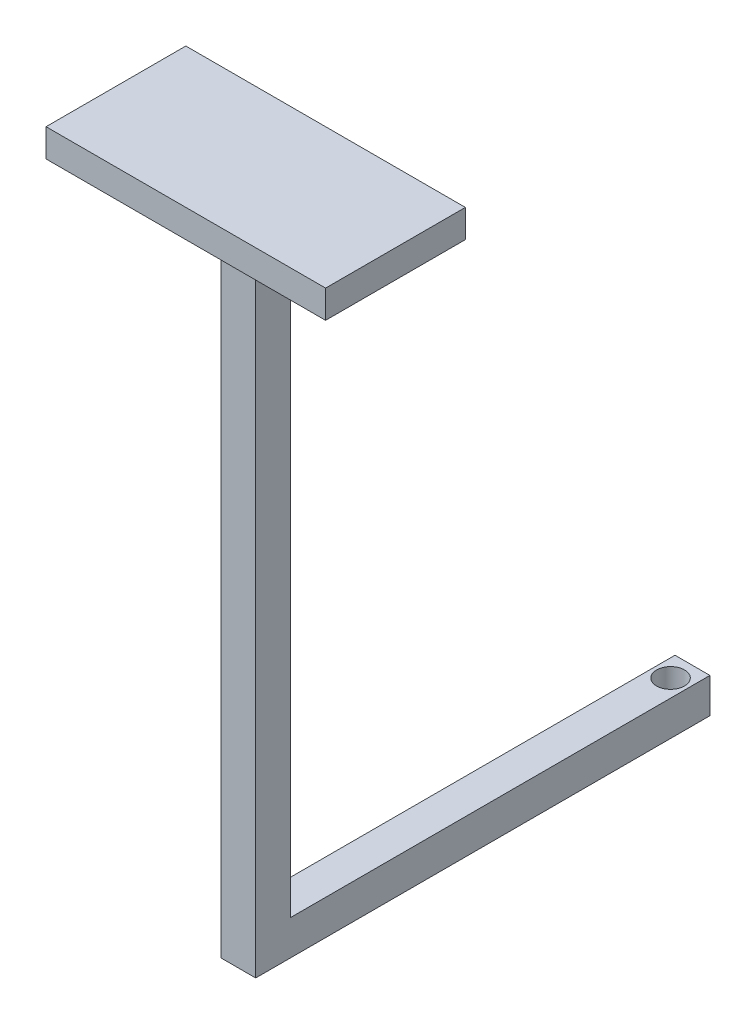
ISO-10303-21;
HEADER;
FILE_DESCRIPTION(('STEP AP214'),'2;1');
FILE_NAME('part.step','',(''),(''),'','','');
FILE_SCHEMA(('AUTOMOTIVE_DESIGN { 1 0 10303 214 1 1 1 1 }'));
ENDSEC;
DATA;
#1=APPLICATION_CONTEXT('core data for automotive mechanical design processes');
#2=APPLICATION_PROTOCOL_DEFINITION('international standard','automotive_design',2000,#1);
#3=PRODUCT_CONTEXT('',#1,'mechanical');
#4=PRODUCT('Part','Part','',(#3));
#5=PRODUCT_RELATED_PRODUCT_CATEGORY('part','',(#4));
#6=PRODUCT_DEFINITION_FORMATION('','',#4);
#7=PRODUCT_DEFINITION_CONTEXT('part definition',#1,'design');
#8=PRODUCT_DEFINITION('design','',#6,#7);
#9=PRODUCT_DEFINITION_SHAPE('','',#8);
#10=(LENGTH_UNIT() NAMED_UNIT(*) SI_UNIT(.MILLI.,.METRE.));
#11=(NAMED_UNIT(*) PLANE_ANGLE_UNIT() SI_UNIT($,.RADIAN.));
#12=(NAMED_UNIT(*) SI_UNIT($,.STERADIAN.) SOLID_ANGLE_UNIT());
#13=UNCERTAINTY_MEASURE_WITH_UNIT(LENGTH_MEASURE(1.E-05),#10,'distance_accuracy_value','');
#14=(GEOMETRIC_REPRESENTATION_CONTEXT(3) GLOBAL_UNCERTAINTY_ASSIGNED_CONTEXT((#13)) GLOBAL_UNIT_ASSIGNED_CONTEXT((#10,
#11,#12)) REPRESENTATION_CONTEXT('',''));
#15=CARTESIAN_POINT('',(0.,0.,0.));
#16=DIRECTION('',(0.,0.,1.));
#17=DIRECTION('',(1.,0.,0.));
#18=AXIS2_PLACEMENT_3D('',#15,#16,#17);
#19=CARTESIAN_POINT('',(-12.5,-470.,-12.5));
#20=DIRECTION('',(0.,0.,-1.));
#21=DIRECTION('',(-1.,0.,0.));
#22=AXIS2_PLACEMENT_3D('',#19,#20,#21);
#23=PLANE('',#22);
#24=DIRECTION('',(0.,1.,0.));
#25=VECTOR('',#24,1.);
#26=CARTESIAN_POINT('',(12.5,-470.,-12.5));
#27=LINE('',#26,#25);
#28=CARTESIAN_POINT('',(12.5,-445.,-12.5));
#29=VERTEX_POINT('',#28);
#30=CARTESIAN_POINT('',(12.5,0.,-12.5));
#31=VERTEX_POINT('',#30);
#32=EDGE_CURVE('E53',#29,#31,#27,.T.);
#33=ORIENTED_EDGE('',*,*,#32,.F.);
#34=DIRECTION('',(1.,0.,0.));
#35=VECTOR('',#34,1.);
#36=CARTESIAN_POINT('',(12.5,-445.,-12.5));
#37=LINE('',#36,#35);
#38=CARTESIAN_POINT('',(-12.5,-445.,-12.5));
#39=VERTEX_POINT('',#38);
#40=EDGE_CURVE('E48',#39,#29,#37,.T.);
#41=ORIENTED_EDGE('',*,*,#40,.F.);
#42=DIRECTION('',(0.,1.,0.));
#43=VECTOR('',#42,1.);
#44=CARTESIAN_POINT('',(-12.5,-470.,-12.5));
#45=LINE('',#44,#43);
#46=CARTESIAN_POINT('',(-12.5,0.,-12.5));
#47=VERTEX_POINT('',#46);
#48=EDGE_CURVE('E165',#39,#47,#45,.T.);
#49=ORIENTED_EDGE('',*,*,#48,.T.);
#50=DIRECTION('',(-1.,0.,0.));
#51=VECTOR('',#50,1.);
#52=CARTESIAN_POINT('',(-12.5,0.,-12.5));
#53=LINE('',#52,#51);
#54=EDGE_CURVE('E154',#31,#47,#53,.T.);
#55=ORIENTED_EDGE('',*,*,#54,.F.);
#56=EDGE_LOOP('',(#33,#41,#49,#55));
#57=FACE_BOUND('',#56,.T.);
#58=ADVANCED_FACE('F33',(#57),#23,.T.);
#59=CARTESIAN_POINT('',(100.,20.,50.));
#60=DIRECTION('',(-1.,0.,0.));
#61=DIRECTION('',(0.,0.,1.));
#62=AXIS2_PLACEMENT_3D('',#59,#60,#61);
#63=PLANE('',#62);
#64=DIRECTION('',(0.,0.,-1.));
#65=VECTOR('',#64,1.);
#66=CARTESIAN_POINT('',(100.,0.,50.));
#67=LINE('',#66,#65);
#68=CARTESIAN_POINT('',(100.,0.,50.));
#69=VERTEX_POINT('',#68);
#70=CARTESIAN_POINT('',(100.,0.,-50.));
#71=VERTEX_POINT('',#70);
#72=EDGE_CURVE('E161',#69,#71,#67,.T.);
#73=ORIENTED_EDGE('',*,*,#72,.T.);
#74=DIRECTION('',(0.,-1.,0.));
#75=VECTOR('',#74,1.);
#76=CARTESIAN_POINT('',(100.,20.,-50.));
#77=LINE('',#76,#75);
#78=CARTESIAN_POINT('',(100.,20.,-50.));
#79=VERTEX_POINT('',#78);
#80=EDGE_CURVE('E11',#79,#71,#77,.T.);
#81=ORIENTED_EDGE('',*,*,#80,.F.);
#82=DIRECTION('',(0.,0.,-1.));
#83=VECTOR('',#82,1.);
#84=CARTESIAN_POINT('',(100.,20.,50.));
#85=LINE('',#84,#83);
#86=CARTESIAN_POINT('',(100.,20.,50.));
#87=VERTEX_POINT('',#86);
#88=EDGE_CURVE('E168',#87,#79,#85,.T.);
#89=ORIENTED_EDGE('',*,*,#88,.F.);
#90=DIRECTION('',(0.,-1.,0.));
#91=VECTOR('',#90,1.);
#92=CARTESIAN_POINT('',(100.,20.,50.));
#93=LINE('',#92,#91);
#94=EDGE_CURVE('E178',#87,#69,#93,.T.);
#95=ORIENTED_EDGE('',*,*,#94,.T.);
#96=EDGE_LOOP('',(#73,#81,#89,#95));
#97=FACE_BOUND('',#96,.T.);
#98=ADVANCED_FACE('F35',(#97),#63,.F.);
#99=CARTESIAN_POINT('',(-100.,20.,-50.));
#100=DIRECTION('',(0.,0.,1.));
#101=DIRECTION('',(1.,0.,0.));
#102=AXIS2_PLACEMENT_3D('',#99,#100,#101);
#103=PLANE('',#102);
#104=DIRECTION('',(-1.,0.,0.));
#105=VECTOR('',#104,1.);
#106=CARTESIAN_POINT('',(-100.,0.,-50.));
#107=LINE('',#106,#105);
#108=CARTESIAN_POINT('',(-100.,0.,-50.));
#109=VERTEX_POINT('',#108);
#110=EDGE_CURVE('E181',#71,#109,#107,.T.);
#111=ORIENTED_EDGE('',*,*,#110,.T.);
#112=DIRECTION('',(0.,-1.,0.));
#113=VECTOR('',#112,1.);
#114=CARTESIAN_POINT('',(-100.,20.,-50.));
#115=LINE('',#114,#113);
#116=CARTESIAN_POINT('',(-100.,20.,-50.));
#117=VERTEX_POINT('',#116);
#118=EDGE_CURVE('E41',#117,#109,#115,.T.);
#119=ORIENTED_EDGE('',*,*,#118,.F.);
#120=DIRECTION('',(-1.,0.,0.));
#121=VECTOR('',#120,1.);
#122=CARTESIAN_POINT('',(-100.,20.,-50.));
#123=LINE('',#122,#121);
#124=EDGE_CURVE('E171',#79,#117,#123,.T.);
#125=ORIENTED_EDGE('',*,*,#124,.F.);
#126=ORIENTED_EDGE('',*,*,#80,.T.);
#127=EDGE_LOOP('',(#111,#119,#125,#126));
#128=FACE_BOUND('',#127,.T.);
#129=ADVANCED_FACE('F211',(#128),#103,.F.);
#130=CARTESIAN_POINT('',(-100.,20.,50.));
#131=DIRECTION('',(1.,0.,0.));
#132=DIRECTION('',(0.,0.,-1.));
#133=AXIS2_PLACEMENT_3D('',#130,#131,#132);
#134=PLANE('',#133);
#135=DIRECTION('',(0.,0.,1.));
#136=VECTOR('',#135,1.);
#137=CARTESIAN_POINT('',(-100.,0.,50.));
#138=LINE('',#137,#136);
#139=CARTESIAN_POINT('',(-100.,0.,50.));
#140=VERTEX_POINT('',#139);
#141=EDGE_CURVE('E183',#109,#140,#138,.T.);
#142=ORIENTED_EDGE('',*,*,#141,.T.);
#143=DIRECTION('',(0.,-1.,0.));
#144=VECTOR('',#143,1.);
#145=CARTESIAN_POINT('',(-100.,20.,50.));
#146=LINE('',#145,#144);
#147=CARTESIAN_POINT('',(-100.,20.,50.));
#148=VERTEX_POINT('',#147);
#149=EDGE_CURVE('E188',#148,#140,#146,.T.);
#150=ORIENTED_EDGE('',*,*,#149,.F.);
#151=DIRECTION('',(0.,0.,1.));
#152=VECTOR('',#151,1.);
#153=CARTESIAN_POINT('',(-100.,20.,50.));
#154=LINE('',#153,#152);
#155=EDGE_CURVE('E174',#117,#148,#154,.T.);
#156=ORIENTED_EDGE('',*,*,#155,.F.);
#157=ORIENTED_EDGE('',*,*,#118,.T.);
#158=EDGE_LOOP('',(#142,#150,#156,#157));
#159=FACE_BOUND('',#158,.T.);
#160=ADVANCED_FACE('F195',(#159),#134,.F.);
#161=CARTESIAN_POINT('',(-100.,20.,50.));
#162=DIRECTION('',(0.,0.,-1.));
#163=DIRECTION('',(-1.,0.,0.));
#164=AXIS2_PLACEMENT_3D('',#161,#162,#163);
#165=PLANE('',#164);
#166=DIRECTION('',(1.,0.,0.));
#167=VECTOR('',#166,1.);
#168=CARTESIAN_POINT('',(-100.,0.,50.));
#169=LINE('',#168,#167);
#170=EDGE_CURVE('E172',#140,#69,#169,.T.);
#171=ORIENTED_EDGE('',*,*,#170,.T.);
#172=ORIENTED_EDGE('',*,*,#94,.F.);
#173=DIRECTION('',(1.,0.,0.));
#174=VECTOR('',#173,1.);
#175=CARTESIAN_POINT('',(-100.,20.,50.));
#176=LINE('',#175,#174);
#177=EDGE_CURVE('E176',#148,#87,#176,.T.);
#178=ORIENTED_EDGE('',*,*,#177,.F.);
#179=ORIENTED_EDGE('',*,*,#149,.T.);
#180=EDGE_LOOP('',(#171,#172,#178,#179));
#181=FACE_BOUND('',#180,.T.);
#182=ADVANCED_FACE('F204',(#181),#165,.F.);
#183=CARTESIAN_POINT('',(0.,20.,0.));
#184=DIRECTION('',(0.,-1.,0.));
#185=DIRECTION('',(0.,0.,-1.));
#186=AXIS2_PLACEMENT_3D('',#183,#184,#185);
#187=PLANE('',#186);
#188=ORIENTED_EDGE('',*,*,#88,.T.);
#189=ORIENTED_EDGE('',*,*,#124,.T.);
#190=ORIENTED_EDGE('',*,*,#155,.T.);
#191=ORIENTED_EDGE('',*,*,#177,.T.);
#192=EDGE_LOOP('',(#188,#189,#190,#191));
#193=FACE_BOUND('',#192,.T.);
#194=ADVANCED_FACE('F210',(#193),#187,.F.);
#195=CARTESIAN_POINT('',(0.,0.,0.));
#196=DIRECTION('',(0.,-1.,0.));
#197=DIRECTION('',(0.,0.,-1.));
#198=AXIS2_PLACEMENT_3D('',#195,#196,#197);
#199=PLANE('',#198);
#200=DIRECTION('',(0.,0.,-1.));
#201=VECTOR('',#200,1.);
#202=CARTESIAN_POINT('',(12.5,0.,12.5));
#203=LINE('',#202,#201);
#204=CARTESIAN_POINT('',(12.5,0.,12.5));
#205=VERTEX_POINT('',#204);
#206=EDGE_CURVE('E147',#205,#31,#203,.T.);
#207=ORIENTED_EDGE('',*,*,#206,.T.);
#208=ORIENTED_EDGE('',*,*,#54,.T.);
#209=DIRECTION('',(0.,0.,1.));
#210=VECTOR('',#209,1.);
#211=CARTESIAN_POINT('',(-12.5,0.,12.5));
#212=LINE('',#211,#210);
#213=CARTESIAN_POINT('',(-12.5,0.,12.5));
#214=VERTEX_POINT('',#213);
#215=EDGE_CURVE('E157',#47,#214,#212,.T.);
#216=ORIENTED_EDGE('',*,*,#215,.T.);
#217=DIRECTION('',(1.,0.,0.));
#218=VECTOR('',#217,1.);
#219=CARTESIAN_POINT('',(-12.5,0.,12.5));
#220=LINE('',#219,#218);
#221=EDGE_CURVE('E121',#214,#205,#220,.T.);
#222=ORIENTED_EDGE('',*,*,#221,.T.);
#223=EDGE_LOOP('',(#207,#208,#216,#222));
#224=FACE_BOUND('',#223,.T.);
#225=ORIENTED_EDGE('',*,*,#72,.F.);
#226=ORIENTED_EDGE('',*,*,#170,.F.);
#227=ORIENTED_EDGE('',*,*,#141,.F.);
#228=ORIENTED_EDGE('',*,*,#110,.F.);
#229=EDGE_LOOP('',(#225,#226,#227,#228));
#230=FACE_BOUND('',#229,.T.);
#231=ADVANCED_FACE('F201',(#224,#230),#199,.T.);
#232=CARTESIAN_POINT('',(12.5,-470.,12.5));
#233=DIRECTION('',(1.,0.,0.));
#234=DIRECTION('',(0.,0.,-1.));
#235=AXIS2_PLACEMENT_3D('',#232,#233,#234);
#236=PLANE('',#235);
#237=ORIENTED_EDGE('',*,*,#206,.F.);
#238=DIRECTION('',(0.,1.,0.));
#239=VECTOR('',#238,1.);
#240=CARTESIAN_POINT('',(12.5,-470.,12.5));
#241=LINE('',#240,#239);
#242=CARTESIAN_POINT('',(12.5,-470.,12.5));
#243=VERTEX_POINT('',#242);
#244=EDGE_CURVE('E116',#243,#205,#241,.T.);
#245=ORIENTED_EDGE('',*,*,#244,.F.);
#246=DIRECTION('',(0.,0.,-1.));
#247=VECTOR('',#246,1.);
#248=CARTESIAN_POINT('',(12.5,-470.,12.5));
#249=LINE('',#248,#247);
#250=CARTESIAN_POINT('',(12.5,-470.,-312.5));
#251=VERTEX_POINT('',#250);
#252=EDGE_CURVE('E108',#243,#251,#249,.T.);
#253=ORIENTED_EDGE('',*,*,#252,.T.);
#254=DIRECTION('',(0.,-1.,0.));
#255=VECTOR('',#254,1.);
#256=CARTESIAN_POINT('',(12.5,-470.,-312.5));
#257=LINE('',#256,#255);
#258=CARTESIAN_POINT('',(12.5,-445.,-312.5));
#259=VERTEX_POINT('',#258);
#260=EDGE_CURVE('E114',#259,#251,#257,.T.);
#261=ORIENTED_EDGE('',*,*,#260,.F.);
#262=DIRECTION('',(0.,0.,1.));
#263=VECTOR('',#262,1.);
#264=CARTESIAN_POINT('',(12.5,-445.,-312.5));
#265=LINE('',#264,#263);
#266=EDGE_CURVE('E142',#259,#29,#265,.T.);
#267=ORIENTED_EDGE('',*,*,#266,.T.);
#268=ORIENTED_EDGE('',*,*,#32,.T.);
#269=EDGE_LOOP('',(#237,#245,#253,#261,#267,#268));
#270=FACE_BOUND('',#269,.T.);
#271=ADVANCED_FACE('F111',(#270),#236,.T.);
#272=CARTESIAN_POINT('',(-12.5,-470.,12.5));
#273=DIRECTION('',(0.,0.,1.));
#274=DIRECTION('',(1.,0.,0.));
#275=AXIS2_PLACEMENT_3D('',#272,#273,#274);
#276=PLANE('',#275);
#277=ORIENTED_EDGE('',*,*,#221,.F.);
#278=DIRECTION('',(0.,1.,0.));
#279=VECTOR('',#278,1.);
#280=CARTESIAN_POINT('',(-12.5,-470.,12.5));
#281=LINE('',#280,#279);
#282=CARTESIAN_POINT('',(-12.5,-470.,12.5));
#283=VERTEX_POINT('',#282);
#284=EDGE_CURVE('E162',#283,#214,#281,.T.);
#285=ORIENTED_EDGE('',*,*,#284,.F.);
#286=DIRECTION('',(1.,0.,0.));
#287=VECTOR('',#286,1.);
#288=CARTESIAN_POINT('',(-12.5,-470.,12.5));
#289=LINE('',#288,#287);
#290=EDGE_CURVE('E150',#283,#243,#289,.T.);
#291=ORIENTED_EDGE('',*,*,#290,.T.);
#292=ORIENTED_EDGE('',*,*,#244,.T.);
#293=EDGE_LOOP('',(#277,#285,#291,#292));
#294=FACE_BOUND('',#293,.T.);
#295=ADVANCED_FACE('F228',(#294),#276,.T.);
#296=CARTESIAN_POINT('',(-12.5,-470.,12.5));
#297=DIRECTION('',(-1.,0.,0.));
#298=DIRECTION('',(0.,0.,1.));
#299=AXIS2_PLACEMENT_3D('',#296,#297,#298);
#300=PLANE('',#299);
#301=ORIENTED_EDGE('',*,*,#215,.F.);
#302=ORIENTED_EDGE('',*,*,#48,.F.);
#303=DIRECTION('',(0.,0.,1.));
#304=VECTOR('',#303,1.);
#305=CARTESIAN_POINT('',(-12.5,-445.,-312.5));
#306=LINE('',#305,#304);
#307=CARTESIAN_POINT('',(-12.5,-445.,-312.5));
#308=VERTEX_POINT('',#307);
#309=EDGE_CURVE('E145',#308,#39,#306,.T.);
#310=ORIENTED_EDGE('',*,*,#309,.F.);
#311=DIRECTION('',(0.,1.,0.));
#312=VECTOR('',#311,1.);
#313=CARTESIAN_POINT('',(-12.5,-470.,-312.5));
#314=LINE('',#313,#312);
#315=CARTESIAN_POINT('',(-12.5,-470.,-312.5));
#316=VERTEX_POINT('',#315);
#317=EDGE_CURVE('E129',#316,#308,#314,.T.);
#318=ORIENTED_EDGE('',*,*,#317,.F.);
#319=DIRECTION('',(0.,0.,1.));
#320=VECTOR('',#319,1.);
#321=CARTESIAN_POINT('',(-12.5,-470.,12.5));
#322=LINE('',#321,#320);
#323=EDGE_CURVE('E120',#316,#283,#322,.T.);
#324=ORIENTED_EDGE('',*,*,#323,.T.);
#325=ORIENTED_EDGE('',*,*,#284,.T.);
#326=EDGE_LOOP('',(#301,#302,#310,#318,#324,#325));
#327=FACE_BOUND('',#326,.T.);
#328=ADVANCED_FACE('F224',(#327),#300,.T.);
#329=CARTESIAN_POINT('',(0.,-470.,0.));
#330=DIRECTION('',(0.,-1.,0.));
#331=DIRECTION('',(0.,0.,-1.));
#332=AXIS2_PLACEMENT_3D('',#329,#330,#331);
#333=PLANE('',#332);
#334=CARTESIAN_POINT('',(0.,-470.,-296.828421151734));
#335=DIRECTION('',(0.,-1.,0.));
#336=DIRECTION('',(0.,0.,-1.));
#337=AXIS2_PLACEMENT_3D('',#334,#335,#336);
#338=CIRCLE('',#337,10.);
#339=CARTESIAN_POINT('',(0.,-470.,-306.828421151734));
#340=VERTEX_POINT('',#339);
#341=EDGE_CURVE('E136',#340,#340,#338,.T.);
#342=ORIENTED_EDGE('',*,*,#341,.F.);
#343=EDGE_LOOP('',(#342));
#344=FACE_BOUND('',#343,.T.);
#345=ORIENTED_EDGE('',*,*,#252,.F.);
#346=ORIENTED_EDGE('',*,*,#290,.F.);
#347=ORIENTED_EDGE('',*,*,#323,.F.);
#348=DIRECTION('',(-1.,0.,0.));
#349=VECTOR('',#348,1.);
#350=CARTESIAN_POINT('',(12.5,-470.,-312.5));
#351=LINE('',#350,#349);
#352=EDGE_CURVE('E124',#251,#316,#351,.T.);
#353=ORIENTED_EDGE('',*,*,#352,.F.);
#354=EDGE_LOOP('',(#345,#346,#347,#353));
#355=FACE_BOUND('',#354,.T.);
#356=ADVANCED_FACE('F125',(#344,#355),#333,.T.);
#357=CARTESIAN_POINT('',(12.5,-445.,-312.5));
#358=DIRECTION('',(0.,-1.,0.));
#359=DIRECTION('',(0.,0.,-1.));
#360=AXIS2_PLACEMENT_3D('',#357,#358,#359);
#361=PLANE('',#360);
#362=CARTESIAN_POINT('',(0.,-445.,-296.828421151734));
#363=DIRECTION('',(0.,1.,0.));
#364=DIRECTION('',(0.,0.,1.));
#365=AXIS2_PLACEMENT_3D('',#362,#363,#364);
#366=CIRCLE('',#365,10.);
#367=CARTESIAN_POINT('',(0.,-445.,-286.828421151734));
#368=VERTEX_POINT('',#367);
#369=EDGE_CURVE('E346',#368,#368,#366,.T.);
#370=ORIENTED_EDGE('',*,*,#369,.F.);
#371=EDGE_LOOP('',(#370));
#372=FACE_BOUND('',#371,.T.);
#373=ORIENTED_EDGE('',*,*,#40,.T.);
#374=ORIENTED_EDGE('',*,*,#266,.F.);
#375=DIRECTION('',(1.,0.,0.));
#376=VECTOR('',#375,1.);
#377=CARTESIAN_POINT('',(12.5,-445.,-312.5));
#378=LINE('',#377,#376);
#379=EDGE_CURVE('E133',#308,#259,#378,.T.);
#380=ORIENTED_EDGE('',*,*,#379,.F.);
#381=ORIENTED_EDGE('',*,*,#309,.T.);
#382=EDGE_LOOP('',(#373,#374,#380,#381));
#383=FACE_BOUND('',#382,.T.);
#384=ADVANCED_FACE('F270',(#372,#383),#361,.F.);
#385=CARTESIAN_POINT('',(0.,0.,-312.5));
#386=DIRECTION('',(0.,0.,1.));
#387=DIRECTION('',(1.,0.,0.));
#388=AXIS2_PLACEMENT_3D('',#385,#386,#387);
#389=PLANE('',#388);
#390=ORIENTED_EDGE('',*,*,#260,.T.);
#391=ORIENTED_EDGE('',*,*,#352,.T.);
#392=ORIENTED_EDGE('',*,*,#317,.T.);
#393=ORIENTED_EDGE('',*,*,#379,.T.);
#394=EDGE_LOOP('',(#390,#391,#392,#393));
#395=FACE_BOUND('',#394,.T.);
#396=ADVANCED_FACE('F131',(#395),#389,.F.);
#397=CARTESIAN_POINT('',(0.,-475.,-296.828421151734));
#398=DIRECTION('',(0.,1.,0.));
#399=DIRECTION('',(0.,0.,1.));
#400=AXIS2_PLACEMENT_3D('',#397,#398,#399);
#401=CYLINDRICAL_SURFACE('',#400,10.);
#402=ORIENTED_EDGE('',*,*,#341,.T.);
#403=EDGE_LOOP('',(#402));
#404=FACE_BOUND('',#403,.T.);
#405=ORIENTED_EDGE('',*,*,#369,.T.);
#406=EDGE_LOOP('',(#405));
#407=FACE_BOUND('',#406,.T.);
#408=ADVANCED_FACE('F285',(#404,#407),#401,.F.);
#409=CLOSED_SHELL('',(#58,#98,#129,#160,#182,#194,#231,#271,#295,#328,#356,#384,#396,#408));
#410=MANIFOLD_SOLID_BREP('B2',#409);
#411=ADVANCED_BREP_SHAPE_REPRESENTATION('',(#18,#410),#14);
#412=SHAPE_DEFINITION_REPRESENTATION(#9,#411);
ENDSEC;
END-ISO-10303-21;
